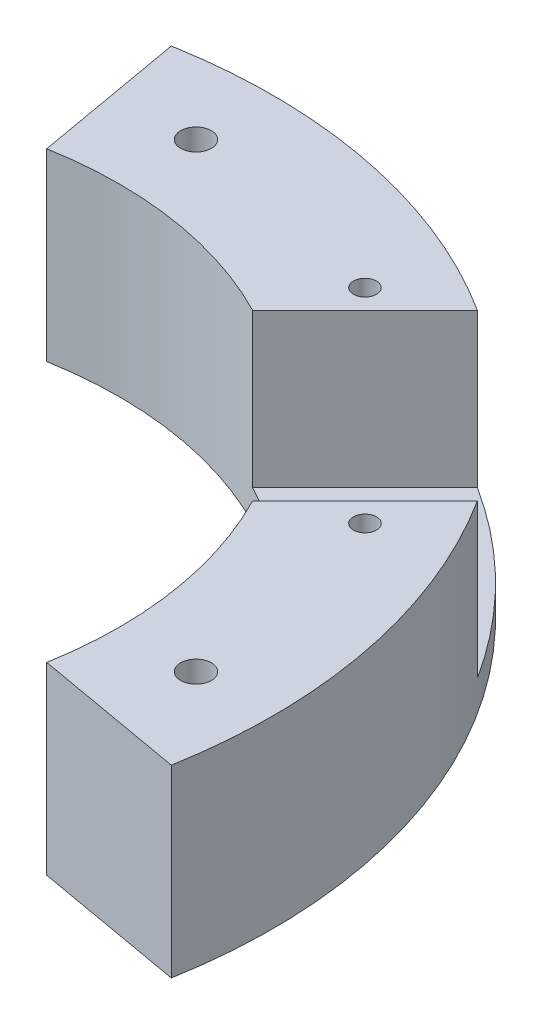
ISO-10303-21;
HEADER;
FILE_DESCRIPTION(('STEP AP214'),'2;1');
FILE_NAME('part.step','',(''),(''),'','','');
FILE_SCHEMA(('AUTOMOTIVE_DESIGN { 1 0 10303 214 1 1 1 1 }'));
ENDSEC;
DATA;
#1=APPLICATION_CONTEXT('core data for automotive mechanical design processes');
#2=APPLICATION_PROTOCOL_DEFINITION('international standard','automotive_design',2000,#1);
#3=PRODUCT_CONTEXT('',#1,'mechanical');
#4=PRODUCT('Part','Part','',(#3));
#5=PRODUCT_RELATED_PRODUCT_CATEGORY('part','',(#4));
#6=PRODUCT_DEFINITION_FORMATION('','',#4);
#7=PRODUCT_DEFINITION_CONTEXT('part definition',#1,'design');
#8=PRODUCT_DEFINITION('design','',#6,#7);
#9=PRODUCT_DEFINITION_SHAPE('','',#8);
#10=(LENGTH_UNIT() NAMED_UNIT(*) SI_UNIT(.MILLI.,.METRE.));
#11=(NAMED_UNIT(*) PLANE_ANGLE_UNIT() SI_UNIT($,.RADIAN.));
#12=(NAMED_UNIT(*) SI_UNIT($,.STERADIAN.) SOLID_ANGLE_UNIT());
#13=UNCERTAINTY_MEASURE_WITH_UNIT(LENGTH_MEASURE(1.E-05),#10,'distance_accuracy_value','');
#14=(GEOMETRIC_REPRESENTATION_CONTEXT(3) GLOBAL_UNCERTAINTY_ASSIGNED_CONTEXT((#13)) GLOBAL_UNIT_ASSIGNED_CONTEXT((#10,
#11,#12)) REPRESENTATION_CONTEXT('',''));
#15=CARTESIAN_POINT('',(0.,0.,0.));
#16=DIRECTION('',(0.,0.,1.));
#17=DIRECTION('',(1.,0.,0.));
#18=AXIS2_PLACEMENT_3D('',#15,#16,#17);
#19=CARTESIAN_POINT('',(0.,30.,0.));
#20=DIRECTION('',(0.,1.,0.));
#21=DIRECTION('',(0.,0.,1.));
#22=AXIS2_PLACEMENT_3D('',#19,#20,#21);
#23=PLANE('',#22);
#24=CARTESIAN_POINT('',(34.6320528403257,30.,-67.8660715560944));
#25=DIRECTION('',(0.,1.,0.));
#26=DIRECTION('',(0.,0.,1.));
#27=AXIS2_PLACEMENT_3D('',#24,#25,#26);
#28=CIRCLE('',#27,1.875);
#29=CARTESIAN_POINT('',(34.6320528403257,30.,-65.9910715560944));
#30=VERTEX_POINT('',#29);
#31=EDGE_CURVE('E234',#30,#30,#28,.T.);
#32=ORIENTED_EDGE('',*,*,#31,.F.);
#33=EDGE_LOOP('',(#32));
#34=FACE_BOUND('',#33,.T.);
#35=DIRECTION('',(-0.707106781186541,0.,0.707106781186554));
#36=VECTOR('',#35,1.);
#37=CARTESIAN_POINT('',(28.6675245242047,30.,-55.5375822092943));
#38=LINE('',#37,#36);
#39=CARTESIAN_POINT('',(46.9605421871256,30.,-73.8305998722155));
#40=VERTEX_POINT('',#39);
#41=CARTESIAN_POINT('',(28.6675245242047,30.,-55.5375822092943));
#42=VERTEX_POINT('',#41);
#43=EDGE_CURVE('E127',#40,#42,#38,.T.);
#44=ORIENTED_EDGE('',*,*,#43,.F.);
#45=CARTESIAN_POINT('',(0.,30.,0.));
#46=DIRECTION('',(0.,1.,0.));
#47=DIRECTION('',(0.,0.,1.));
#48=AXIS2_PLACEMENT_3D('',#45,#46,#47);
#49=CIRCLE('',#48,87.5);
#50=CARTESIAN_POINT('',(-15.1942155458574,30.,-86.170678388568));
#51=VERTEX_POINT('',#50);
#52=EDGE_CURVE('E154',#40,#51,#49,.T.);
#53=ORIENTED_EDGE('',*,*,#52,.T.);
#54=DIRECTION('',(0.173648177666941,0.,0.984807753012206));
#55=VECTOR('',#54,1.);
#56=CARTESIAN_POINT('',(-10.8530111041838,30.,-61.5504845632629));
#57=LINE('',#56,#55);
#58=CARTESIAN_POINT('',(-10.8530111041838,30.,-61.5504845632629));
#59=VERTEX_POINT('',#58);
#60=EDGE_CURVE('E61',#51,#59,#57,.T.);
#61=ORIENTED_EDGE('',*,*,#60,.T.);
#62=CARTESIAN_POINT('',(0.,30.,0.));
#63=DIRECTION('',(0.,-1.,0.));
#64=DIRECTION('',(0.,0.,1.));
#65=AXIS2_PLACEMENT_3D('',#62,#63,#64);
#66=CIRCLE('',#65,62.5);
#67=EDGE_CURVE('E150',#59,#42,#66,.T.);
#68=ORIENTED_EDGE('',*,*,#67,.T.);
#69=EDGE_LOOP('',(#44,#53,#61,#68));
#70=FACE_BOUND('',#69,.T.);
#71=CARTESIAN_POINT('',(0.,30.,-75.));
#72=DIRECTION('',(0.,1.,0.));
#73=DIRECTION('',(0.,0.,1.));
#74=AXIS2_PLACEMENT_3D('',#71,#72,#73);
#75=CIRCLE('',#74,2.5);
#76=CARTESIAN_POINT('',(0.,30.,-72.5));
#77=VERTEX_POINT('',#76);
#78=EDGE_CURVE('E136',#77,#77,#75,.T.);
#79=ORIENTED_EDGE('',*,*,#78,.F.);
#80=EDGE_LOOP('',(#79));
#81=FACE_BOUND('',#80,.T.);
#82=ADVANCED_FACE('F37',(#34,#70,#81),#23,.T.);
#83=CARTESIAN_POINT('',(67.8660715560937,30.,-34.6320528403269));
#84=DIRECTION('',(0.,1.,0.));
#85=DIRECTION('',(0.,0.,1.));
#86=AXIS2_PLACEMENT_3D('',#83,#84,#85);
#87=CIRCLE('',#86,1.875);
#88=CARTESIAN_POINT('',(67.8660715560937,30.,-32.7570528403269));
#89=VERTEX_POINT('',#88);
#90=EDGE_CURVE('E237',#89,#89,#87,.T.);
#91=ORIENTED_EDGE('',*,*,#90,.F.);
#92=EDGE_LOOP('',(#91));
#93=FACE_BOUND('',#92,.T.);
#94=DIRECTION('',(0.707106781186541,0.,-0.707106781186554));
#95=VECTOR('',#94,1.);
#96=CARTESIAN_POINT('',(55.5375822092937,30.,-28.6675245242057));
#97=LINE('',#96,#95);
#98=CARTESIAN_POINT('',(55.5375822092937,30.,-28.6675245242057));
#99=VERTEX_POINT('',#98);
#100=CARTESIAN_POINT('',(73.8305998722147,30.,-46.960542187127));
#101=VERTEX_POINT('',#100);
#102=EDGE_CURVE('E188',#99,#101,#97,.T.);
#103=ORIENTED_EDGE('',*,*,#102,.F.);
#104=CARTESIAN_POINT('',(61.5504845632631,30.,10.8530111041827));
#105=VERTEX_POINT('',#104);
#106=EDGE_CURVE('E90',#99,#105,#66,.T.);
#107=ORIENTED_EDGE('',*,*,#106,.T.);
#108=DIRECTION('',(0.984807753012209,0.,0.173648177666924));
#109=VECTOR('',#108,1.);
#110=CARTESIAN_POINT('',(61.5504845632631,30.,10.8530111041827));
#111=LINE('',#110,#109);
#112=CARTESIAN_POINT('',(86.1706783885683,30.,15.1942155458558));
#113=VERTEX_POINT('',#112);
#114=EDGE_CURVE('E152',#105,#113,#111,.T.);
#115=ORIENTED_EDGE('',*,*,#114,.T.);
#116=EDGE_CURVE('E155',#113,#101,#49,.T.);
#117=ORIENTED_EDGE('',*,*,#116,.T.);
#118=EDGE_LOOP('',(#103,#107,#115,#117));
#119=FACE_BOUND('',#118,.T.);
#120=CARTESIAN_POINT('',(75.,30.,0.));
#121=DIRECTION('',(0.,1.,0.));
#122=DIRECTION('',(0.,0.,1.));
#123=AXIS2_PLACEMENT_3D('',#120,#121,#122);
#124=CIRCLE('',#123,2.50000000000001);
#125=CARTESIAN_POINT('',(75.,30.,2.50000000000001));
#126=VERTEX_POINT('',#125);
#127=EDGE_CURVE('E144',#126,#126,#124,.T.);
#128=ORIENTED_EDGE('',*,*,#127,.F.);
#129=EDGE_LOOP('',(#128));
#130=FACE_BOUND('',#129,.T.);
#131=ADVANCED_FACE('F207',(#93,#119,#130),#23,.T.);
#132=CARTESIAN_POINT('',(0.,0.,0.));
#133=DIRECTION('',(0.,1.,0.));
#134=DIRECTION('',(0.,0.,1.));
#135=AXIS2_PLACEMENT_3D('',#132,#133,#134);
#136=PLANE('',#135);
#137=CARTESIAN_POINT('',(67.8660715560937,0.,-34.6320528403269));
#138=DIRECTION('',(0.,1.,0.));
#139=DIRECTION('',(0.,0.,1.));
#140=AXIS2_PLACEMENT_3D('',#137,#138,#139);
#141=CIRCLE('',#140,1.875);
#142=CARTESIAN_POINT('',(67.8660715560937,0.,-32.7570528403269));
#143=VERTEX_POINT('',#142);
#144=EDGE_CURVE('E190',#143,#143,#141,.T.);
#145=ORIENTED_EDGE('',*,*,#144,.T.);
#146=EDGE_LOOP('',(#145));
#147=FACE_BOUND('',#146,.T.);
#148=CARTESIAN_POINT('',(34.6320528403257,0.,-67.8660715560944));
#149=DIRECTION('',(0.,1.,0.));
#150=DIRECTION('',(0.,0.,1.));
#151=AXIS2_PLACEMENT_3D('',#148,#149,#150);
#152=CIRCLE('',#151,1.875);
#153=CARTESIAN_POINT('',(34.6320528403257,0.,-65.9910715560944));
#154=VERTEX_POINT('',#153);
#155=EDGE_CURVE('E231',#154,#154,#152,.T.);
#156=ORIENTED_EDGE('',*,*,#155,.T.);
#157=EDGE_LOOP('',(#156));
#158=FACE_BOUND('',#157,.T.);
#159=CARTESIAN_POINT('',(0.,0.,0.));
#160=DIRECTION('',(0.,-1.,0.));
#161=DIRECTION('',(0.,0.,1.));
#162=AXIS2_PLACEMENT_3D('',#159,#160,#161);
#163=CIRCLE('',#162,62.5);
#164=CARTESIAN_POINT('',(-10.8530111041838,0.,-61.5504845632629));
#165=VERTEX_POINT('',#164);
#166=CARTESIAN_POINT('',(61.5504845632631,0.,10.8530111041827));
#167=VERTEX_POINT('',#166);
#168=EDGE_CURVE('E147',#165,#167,#163,.T.);
#169=ORIENTED_EDGE('',*,*,#168,.F.);
#170=DIRECTION('',(0.173648177666941,0.,0.984807753012206));
#171=VECTOR('',#170,1.);
#172=CARTESIAN_POINT('',(-10.8530111041838,0.,-61.5504845632629));
#173=LINE('',#172,#171);
#174=CARTESIAN_POINT('',(-15.1942155458574,0.,-86.170678388568));
#175=VERTEX_POINT('',#174);
#176=EDGE_CURVE('E82',#175,#165,#173,.T.);
#177=ORIENTED_EDGE('',*,*,#176,.F.);
#178=CARTESIAN_POINT('',(0.,0.,0.));
#179=DIRECTION('',(0.,1.,0.));
#180=DIRECTION('',(0.,0.,1.));
#181=AXIS2_PLACEMENT_3D('',#178,#179,#180);
#182=CIRCLE('',#181,87.5);
#183=CARTESIAN_POINT('',(86.1706783885683,0.,15.1942155458558));
#184=VERTEX_POINT('',#183);
#185=EDGE_CURVE('E164',#184,#175,#182,.T.);
#186=ORIENTED_EDGE('',*,*,#185,.F.);
#187=DIRECTION('',(0.984807753012209,0.,0.173648177666924));
#188=VECTOR('',#187,1.);
#189=CARTESIAN_POINT('',(61.5504845632631,0.,10.8530111041827));
#190=LINE('',#189,#188);
#191=EDGE_CURVE('E162',#167,#184,#190,.T.);
#192=ORIENTED_EDGE('',*,*,#191,.F.);
#193=EDGE_LOOP('',(#169,#177,#186,#192));
#194=FACE_BOUND('',#193,.T.);
#195=CARTESIAN_POINT('',(75.,0.,0.));
#196=DIRECTION('',(0.,1.,0.));
#197=DIRECTION('',(0.,0.,1.));
#198=AXIS2_PLACEMENT_3D('',#195,#196,#197);
#199=CIRCLE('',#198,2.50000000000001);
#200=CARTESIAN_POINT('',(75.,0.,2.50000000000001));
#201=VERTEX_POINT('',#200);
#202=EDGE_CURVE('E139',#201,#201,#199,.T.);
#203=ORIENTED_EDGE('',*,*,#202,.T.);
#204=EDGE_LOOP('',(#203));
#205=FACE_BOUND('',#204,.T.);
#206=CARTESIAN_POINT('',(0.,0.,-75.));
#207=DIRECTION('',(0.,1.,0.));
#208=DIRECTION('',(0.,0.,1.));
#209=AXIS2_PLACEMENT_3D('',#206,#207,#208);
#210=CIRCLE('',#209,2.5);
#211=CARTESIAN_POINT('',(0.,0.,-72.5));
#212=VERTEX_POINT('',#211);
#213=EDGE_CURVE('E140',#212,#212,#210,.T.);
#214=ORIENTED_EDGE('',*,*,#213,.T.);
#215=EDGE_LOOP('',(#214));
#216=FACE_BOUND('',#215,.T.);
#217=ADVANCED_FACE('F180',(#147,#158,#194,#205,#216),#136,.F.);
#218=CARTESIAN_POINT('',(0.,30.,0.));
#219=DIRECTION('',(0.,-1.,0.));
#220=DIRECTION('',(0.,0.,-1.));
#221=AXIS2_PLACEMENT_3D('',#218,#219,#220);
#222=CYLINDRICAL_SURFACE('',#221,62.5);
#223=CARTESIAN_POINT('',(0.,5.,0.));
#224=DIRECTION('',(0.,-1.,0.));
#225=DIRECTION('',(0.,0.,1.));
#226=AXIS2_PLACEMENT_3D('',#223,#224,#225);
#227=CIRCLE('',#226,62.5);
#228=CARTESIAN_POINT('',(28.6675245242047,5.,-55.5375822092943));
#229=VERTEX_POINT('',#228);
#230=CARTESIAN_POINT('',(55.5375822092937,5.,-28.6675245242057));
#231=VERTEX_POINT('',#230);
#232=EDGE_CURVE('E118',#229,#231,#227,.T.);
#233=ORIENTED_EDGE('',*,*,#232,.F.);
#234=DIRECTION('',(0.,1.,0.));
#235=VECTOR('',#234,1.);
#236=CARTESIAN_POINT('',(28.6675245242047,5.,-55.5375822092943));
#237=LINE('',#236,#235);
#238=EDGE_CURVE('E143',#229,#42,#237,.T.);
#239=ORIENTED_EDGE('',*,*,#238,.T.);
#240=ORIENTED_EDGE('',*,*,#67,.F.);
#241=DIRECTION('',(0.,-1.,0.));
#242=VECTOR('',#241,1.);
#243=CARTESIAN_POINT('',(-10.8530111041838,30.,-61.5504845632629));
#244=LINE('',#243,#242);
#245=EDGE_CURVE('E159',#59,#165,#244,.T.);
#246=ORIENTED_EDGE('',*,*,#245,.T.);
#247=ORIENTED_EDGE('',*,*,#168,.T.);
#248=DIRECTION('',(0.,-1.,0.));
#249=VECTOR('',#248,1.);
#250=CARTESIAN_POINT('',(61.5504845632631,30.,10.8530111041827));
#251=LINE('',#250,#249);
#252=EDGE_CURVE('E11',#105,#167,#251,.T.);
#253=ORIENTED_EDGE('',*,*,#252,.F.);
#254=ORIENTED_EDGE('',*,*,#106,.F.);
#255=DIRECTION('',(0.,1.,0.));
#256=VECTOR('',#255,1.);
#257=CARTESIAN_POINT('',(55.5375822092937,5.,-28.6675245242057));
#258=LINE('',#257,#256);
#259=EDGE_CURVE('E113',#231,#99,#258,.T.);
#260=ORIENTED_EDGE('',*,*,#259,.F.);
#261=EDGE_LOOP('',(#233,#239,#240,#246,#247,#253,#254,#260));
#262=FACE_BOUND('',#261,.T.);
#263=ADVANCED_FACE('F39',(#262),#222,.F.);
#264=CARTESIAN_POINT('',(61.5504845632631,30.,10.8530111041827));
#265=DIRECTION('',(0.173648177666924,0.,-0.984807753012209));
#266=DIRECTION('',(-0.984807753012209,0.,-0.173648177666924));
#267=AXIS2_PLACEMENT_3D('',#264,#265,#266);
#268=PLANE('',#267);
#269=ORIENTED_EDGE('',*,*,#191,.T.);
#270=DIRECTION('',(0.,-1.,0.));
#271=VECTOR('',#270,1.);
#272=CARTESIAN_POINT('',(86.1706783885683,30.,15.1942155458558));
#273=LINE('',#272,#271);
#274=EDGE_CURVE('E45',#113,#184,#273,.T.);
#275=ORIENTED_EDGE('',*,*,#274,.F.);
#276=ORIENTED_EDGE('',*,*,#114,.F.);
#277=ORIENTED_EDGE('',*,*,#252,.T.);
#278=EDGE_LOOP('',(#269,#275,#276,#277));
#279=FACE_BOUND('',#278,.T.);
#280=ADVANCED_FACE('F223',(#279),#268,.F.);
#281=CARTESIAN_POINT('',(0.,30.,0.));
#282=DIRECTION('',(0.,-1.,0.));
#283=DIRECTION('',(0.,0.,-1.));
#284=AXIS2_PLACEMENT_3D('',#281,#282,#283);
#285=CYLINDRICAL_SURFACE('',#284,87.5);
#286=ORIENTED_EDGE('',*,*,#52,.F.);
#287=DIRECTION('',(0.,1.,0.));
#288=VECTOR('',#287,1.);
#289=CARTESIAN_POINT('',(46.9605421871256,5.,-73.8305998722155));
#290=LINE('',#289,#288);
#291=CARTESIAN_POINT('',(46.9605421871256,5.,-73.8305998722155));
#292=VERTEX_POINT('',#291);
#293=EDGE_CURVE('E131',#292,#40,#290,.T.);
#294=ORIENTED_EDGE('',*,*,#293,.F.);
#295=CARTESIAN_POINT('',(0.,5.,0.));
#296=DIRECTION('',(0.,1.,0.));
#297=DIRECTION('',(0.,0.,1.));
#298=AXIS2_PLACEMENT_3D('',#295,#296,#297);
#299=CIRCLE('',#298,87.5);
#300=CARTESIAN_POINT('',(73.8305998722147,5.,-46.960542187127));
#301=VERTEX_POINT('',#300);
#302=EDGE_CURVE('E117',#301,#292,#299,.T.);
#303=ORIENTED_EDGE('',*,*,#302,.F.);
#304=DIRECTION('',(0.,1.,0.));
#305=VECTOR('',#304,1.);
#306=CARTESIAN_POINT('',(73.8305998722147,5.,-46.960542187127));
#307=LINE('',#306,#305);
#308=EDGE_CURVE('E115',#301,#101,#307,.T.);
#309=ORIENTED_EDGE('',*,*,#308,.T.);
#310=ORIENTED_EDGE('',*,*,#116,.F.);
#311=ORIENTED_EDGE('',*,*,#274,.T.);
#312=ORIENTED_EDGE('',*,*,#185,.T.);
#313=DIRECTION('',(0.,-1.,0.));
#314=VECTOR('',#313,1.);
#315=CARTESIAN_POINT('',(-15.1942155458574,30.,-86.170678388568));
#316=LINE('',#315,#314);
#317=EDGE_CURVE('E168',#51,#175,#316,.T.);
#318=ORIENTED_EDGE('',*,*,#317,.F.);
#319=EDGE_LOOP('',(#286,#294,#303,#309,#310,#311,#312,#318));
#320=FACE_BOUND('',#319,.T.);
#321=ADVANCED_FACE('F175',(#320),#285,.T.);
#322=CARTESIAN_POINT('',(-10.8530111041838,30.,-61.5504845632629));
#323=DIRECTION('',(0.984807753012206,0.,-0.173648177666941));
#324=DIRECTION('',(-0.173648177666941,0.,-0.984807753012206));
#325=AXIS2_PLACEMENT_3D('',#322,#323,#324);
#326=PLANE('',#325);
#327=ORIENTED_EDGE('',*,*,#176,.T.);
#328=ORIENTED_EDGE('',*,*,#245,.F.);
#329=ORIENTED_EDGE('',*,*,#60,.F.);
#330=ORIENTED_EDGE('',*,*,#317,.T.);
#331=EDGE_LOOP('',(#327,#328,#329,#330));
#332=FACE_BOUND('',#331,.T.);
#333=ADVANCED_FACE('F183',(#332),#326,.F.);
#334=CARTESIAN_POINT('',(75.,30.,0.));
#335=DIRECTION('',(0.,-1.,0.));
#336=DIRECTION('',(0.,0.,-1.));
#337=AXIS2_PLACEMENT_3D('',#334,#335,#336);
#338=CYLINDRICAL_SURFACE('',#337,2.50000000000001);
#339=ORIENTED_EDGE('',*,*,#127,.T.);
#340=EDGE_LOOP('',(#339));
#341=FACE_BOUND('',#340,.T.);
#342=ORIENTED_EDGE('',*,*,#202,.F.);
#343=EDGE_LOOP('',(#342));
#344=FACE_BOUND('',#343,.T.);
#345=ADVANCED_FACE('F202',(#341,#344),#338,.F.);
#346=CARTESIAN_POINT('',(0.,30.,-75.));
#347=DIRECTION('',(0.,-1.,0.));
#348=DIRECTION('',(0.,0.,-1.));
#349=AXIS2_PLACEMENT_3D('',#346,#347,#348);
#350=CYLINDRICAL_SURFACE('',#349,2.5);
#351=ORIENTED_EDGE('',*,*,#78,.T.);
#352=EDGE_LOOP('',(#351));
#353=FACE_BOUND('',#352,.T.);
#354=ORIENTED_EDGE('',*,*,#213,.F.);
#355=EDGE_LOOP('',(#354));
#356=FACE_BOUND('',#355,.T.);
#357=ADVANCED_FACE('F195',(#353,#356),#350,.F.);
#358=CARTESIAN_POINT('',(28.6675245242047,5.,-55.5375822092943));
#359=DIRECTION('',(-0.707106781186554,0.,-0.707106781186541));
#360=DIRECTION('',(-0.707106781186541,0.,0.707106781186554));
#361=AXIS2_PLACEMENT_3D('',#358,#359,#360);
#362=PLANE('',#361);
#363=ORIENTED_EDGE('',*,*,#43,.T.);
#364=ORIENTED_EDGE('',*,*,#238,.F.);
#365=DIRECTION('',(-0.707106781186541,0.,0.707106781186554));
#366=VECTOR('',#365,1.);
#367=CARTESIAN_POINT('',(28.6675245242047,5.,-55.5375822092943));
#368=LINE('',#367,#366);
#369=EDGE_CURVE('E124',#292,#229,#368,.T.);
#370=ORIENTED_EDGE('',*,*,#369,.F.);
#371=ORIENTED_EDGE('',*,*,#293,.T.);
#372=EDGE_LOOP('',(#363,#364,#370,#371));
#373=FACE_BOUND('',#372,.T.);
#374=ADVANCED_FACE('F193',(#373),#362,.F.);
#375=CARTESIAN_POINT('',(55.5375822092937,5.,-28.6675245242057));
#376=DIRECTION('',(0.707106781186554,0.,0.707106781186541));
#377=DIRECTION('',(0.707106781186541,0.,-0.707106781186554));
#378=AXIS2_PLACEMENT_3D('',#375,#376,#377);
#379=PLANE('',#378);
#380=ORIENTED_EDGE('',*,*,#102,.T.);
#381=ORIENTED_EDGE('',*,*,#308,.F.);
#382=DIRECTION('',(0.707106781186541,0.,-0.707106781186554));
#383=VECTOR('',#382,1.);
#384=CARTESIAN_POINT('',(55.5375822092937,5.,-28.6675245242057));
#385=LINE('',#384,#383);
#386=EDGE_CURVE('E52',#231,#301,#385,.T.);
#387=ORIENTED_EDGE('',*,*,#386,.F.);
#388=ORIENTED_EDGE('',*,*,#259,.T.);
#389=EDGE_LOOP('',(#380,#381,#387,#388));
#390=FACE_BOUND('',#389,.T.);
#391=ADVANCED_FACE('F111',(#390),#379,.F.);
#392=CARTESIAN_POINT('',(0.,5.,0.));
#393=DIRECTION('',(0.,1.,0.));
#394=DIRECTION('',(0.,0.,1.));
#395=AXIS2_PLACEMENT_3D('',#392,#393,#394);
#396=PLANE('',#395);
#397=ORIENTED_EDGE('',*,*,#232,.T.);
#398=ORIENTED_EDGE('',*,*,#386,.T.);
#399=ORIENTED_EDGE('',*,*,#302,.T.);
#400=ORIENTED_EDGE('',*,*,#369,.T.);
#401=EDGE_LOOP('',(#397,#398,#399,#400));
#402=FACE_BOUND('',#401,.T.);
#403=ADVANCED_FACE('F122',(#402),#396,.T.);
#404=CARTESIAN_POINT('',(34.6320528403257,0.,-67.8660715560944));
#405=DIRECTION('',(0.,1.,0.));
#406=DIRECTION('',(0.,0.,1.));
#407=AXIS2_PLACEMENT_3D('',#404,#405,#406);
#408=CYLINDRICAL_SURFACE('',#407,1.875);
#409=ORIENTED_EDGE('',*,*,#155,.F.);
#410=EDGE_LOOP('',(#409));
#411=FACE_BOUND('',#410,.T.);
#412=ORIENTED_EDGE('',*,*,#31,.T.);
#413=EDGE_LOOP('',(#412));
#414=FACE_BOUND('',#413,.T.);
#415=ADVANCED_FACE('F247',(#411,#414),#408,.F.);
#416=CARTESIAN_POINT('',(67.8660715560937,0.,-34.6320528403269));
#417=DIRECTION('',(0.,1.,0.));
#418=DIRECTION('',(0.,0.,1.));
#419=AXIS2_PLACEMENT_3D('',#416,#417,#418);
#420=CYLINDRICAL_SURFACE('',#419,1.875);
#421=ORIENTED_EDGE('',*,*,#144,.F.);
#422=EDGE_LOOP('',(#421));
#423=FACE_BOUND('',#422,.T.);
#424=ORIENTED_EDGE('',*,*,#90,.T.);
#425=EDGE_LOOP('',(#424));
#426=FACE_BOUND('',#425,.T.);
#427=ADVANCED_FACE('F244',(#423,#426),#420,.F.);
#428=CLOSED_SHELL('',(#82,#131,#217,#263,#280,#321,#333,#345,#357,#374,#391,#403,#415,#427));
#429=MANIFOLD_SOLID_BREP('B2',#428);
#430=ADVANCED_BREP_SHAPE_REPRESENTATION('',(#18,#429),#14);
#431=SHAPE_DEFINITION_REPRESENTATION(#9,#430);
ENDSEC;
END-ISO-10303-21;
